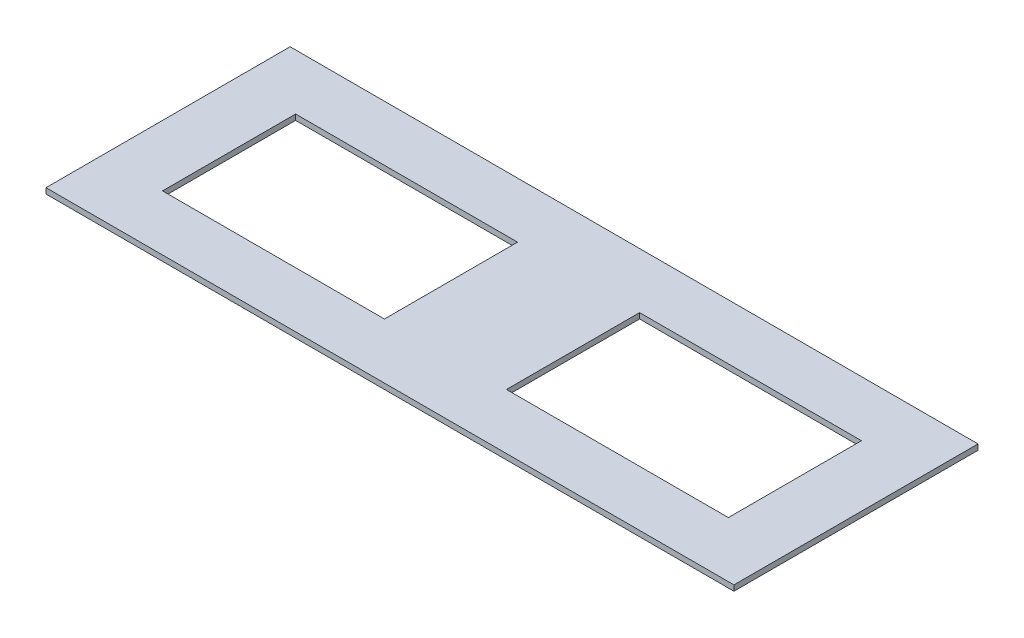
ISO-10303-21;
HEADER;
FILE_DESCRIPTION(('STEP AP214'),'2;1');
FILE_NAME('part.step','',(''),(''),'','','');
FILE_SCHEMA(('AUTOMOTIVE_DESIGN { 1 0 10303 214 1 1 1 1 }'));
ENDSEC;
DATA;
#1=APPLICATION_CONTEXT('core data for automotive mechanical design processes');
#2=APPLICATION_PROTOCOL_DEFINITION('international standard','automotive_design',2000,#1);
#3=PRODUCT_CONTEXT('',#1,'mechanical');
#4=PRODUCT('Part','Part','',(#3));
#5=PRODUCT_RELATED_PRODUCT_CATEGORY('part','',(#4));
#6=PRODUCT_DEFINITION_FORMATION('','',#4);
#7=PRODUCT_DEFINITION_CONTEXT('part definition',#1,'design');
#8=PRODUCT_DEFINITION('design','',#6,#7);
#9=PRODUCT_DEFINITION_SHAPE('','',#8);
#10=(LENGTH_UNIT() NAMED_UNIT(*) SI_UNIT(.MILLI.,.METRE.));
#11=(NAMED_UNIT(*) PLANE_ANGLE_UNIT() SI_UNIT($,.RADIAN.));
#12=(NAMED_UNIT(*) SI_UNIT($,.STERADIAN.) SOLID_ANGLE_UNIT());
#13=UNCERTAINTY_MEASURE_WITH_UNIT(LENGTH_MEASURE(1.E-05),#10,'distance_accuracy_value','');
#14=(GEOMETRIC_REPRESENTATION_CONTEXT(3) GLOBAL_UNCERTAINTY_ASSIGNED_CONTEXT((#13)) GLOBAL_UNIT_ASSIGNED_CONTEXT((#10,
#11,#12)) REPRESENTATION_CONTEXT('',''));
#15=CARTESIAN_POINT('',(0.,0.,0.));
#16=DIRECTION('',(0.,0.,1.));
#17=DIRECTION('',(1.,0.,0.));
#18=AXIS2_PLACEMENT_3D('',#15,#16,#17);
#19=CARTESIAN_POINT('',(0.,12.7,0.));
#20=DIRECTION('',(0.,-1.,0.));
#21=DIRECTION('',(0.,0.,-1.));
#22=AXIS2_PLACEMENT_3D('',#19,#20,#21);
#23=PLANE('',#22);
#24=DIRECTION('',(0.,0.,-1.));
#25=VECTOR('',#24,1.);
#26=CARTESIAN_POINT('',(-139.7,12.7,152.4));
#27=LINE('',#26,#25);
#28=CARTESIAN_POINT('',(-139.7,12.7,152.4));
#29=VERTEX_POINT('',#28);
#30=CARTESIAN_POINT('',(-139.7,12.7,-152.4));
#31=VERTEX_POINT('',#30);
#32=EDGE_CURVE('E158',#29,#31,#27,.T.);
#33=ORIENTED_EDGE('',*,*,#32,.F.);
#34=DIRECTION('',(1.,0.,0.));
#35=VECTOR('',#34,1.);
#36=CARTESIAN_POINT('',(-647.7,12.7,152.4));
#37=LINE('',#36,#35);
#38=CARTESIAN_POINT('',(-647.7,12.7,152.4));
#39=VERTEX_POINT('',#38);
#40=EDGE_CURVE('E166',#39,#29,#37,.T.);
#41=ORIENTED_EDGE('',*,*,#40,.F.);
#42=DIRECTION('',(0.,0.,1.));
#43=VECTOR('',#42,1.);
#44=CARTESIAN_POINT('',(-647.7,12.7,152.4));
#45=LINE('',#44,#43);
#46=CARTESIAN_POINT('',(-647.7,12.7,-152.4));
#47=VERTEX_POINT('',#46);
#48=EDGE_CURVE('E163',#47,#39,#45,.T.);
#49=ORIENTED_EDGE('',*,*,#48,.F.);
#50=DIRECTION('',(-1.,0.,0.));
#51=VECTOR('',#50,1.);
#52=CARTESIAN_POINT('',(-647.7,12.7,-152.4));
#53=LINE('',#52,#51);
#54=EDGE_CURVE('E160',#31,#47,#53,.T.);
#55=ORIENTED_EDGE('',*,*,#54,.F.);
#56=EDGE_LOOP('',(#33,#41,#49,#55));
#57=FACE_BOUND('',#56,.T.);
#58=DIRECTION('',(0.,0.,-1.));
#59=VECTOR('',#58,1.);
#60=CARTESIAN_POINT('',(787.4,12.7,279.4));
#61=LINE('',#60,#59);
#62=CARTESIAN_POINT('',(787.4,12.7,279.4));
#63=VERTEX_POINT('',#62);
#64=CARTESIAN_POINT('',(787.4,12.7,-279.4));
#65=VERTEX_POINT('',#64);
#66=EDGE_CURVE('E189',#63,#65,#61,.T.);
#67=ORIENTED_EDGE('',*,*,#66,.T.);
#68=DIRECTION('',(-1.,0.,0.));
#69=VECTOR('',#68,1.);
#70=CARTESIAN_POINT('',(-787.4,12.7,-279.4));
#71=LINE('',#70,#69);
#72=CARTESIAN_POINT('',(-787.4,12.7,-279.4));
#73=VERTEX_POINT('',#72);
#74=EDGE_CURVE('E192',#65,#73,#71,.T.);
#75=ORIENTED_EDGE('',*,*,#74,.T.);
#76=DIRECTION('',(0.,0.,1.));
#77=VECTOR('',#76,1.);
#78=CARTESIAN_POINT('',(-787.4,12.7,279.4));
#79=LINE('',#78,#77);
#80=CARTESIAN_POINT('',(-787.4,12.7,279.4));
#81=VERTEX_POINT('',#80);
#82=EDGE_CURVE('E195',#73,#81,#79,.T.);
#83=ORIENTED_EDGE('',*,*,#82,.T.);
#84=DIRECTION('',(1.,0.,0.));
#85=VECTOR('',#84,1.);
#86=CARTESIAN_POINT('',(-787.4,12.7,279.4));
#87=LINE('',#86,#85);
#88=EDGE_CURVE('E197',#81,#63,#87,.T.);
#89=ORIENTED_EDGE('',*,*,#88,.T.);
#90=EDGE_LOOP('',(#67,#75,#83,#89));
#91=FACE_BOUND('',#90,.T.);
#92=DIRECTION('',(0.,0.,-1.));
#93=VECTOR('',#92,1.);
#94=CARTESIAN_POINT('',(647.7,12.7,152.4));
#95=LINE('',#94,#93);
#96=CARTESIAN_POINT('',(647.7,12.7,152.4));
#97=VERTEX_POINT('',#96);
#98=CARTESIAN_POINT('',(647.7,12.7,-152.4));
#99=VERTEX_POINT('',#98);
#100=EDGE_CURVE('E122',#97,#99,#95,.T.);
#101=ORIENTED_EDGE('',*,*,#100,.F.);
#102=DIRECTION('',(1.,0.,0.));
#103=VECTOR('',#102,1.);
#104=CARTESIAN_POINT('',(139.7,12.7,152.4));
#105=LINE('',#104,#103);
#106=CARTESIAN_POINT('',(139.7,12.7,152.4));
#107=VERTEX_POINT('',#106);
#108=EDGE_CURVE('E144',#107,#97,#105,.T.);
#109=ORIENTED_EDGE('',*,*,#108,.F.);
#110=DIRECTION('',(0.,0.,1.));
#111=VECTOR('',#110,1.);
#112=CARTESIAN_POINT('',(139.7,12.7,152.4));
#113=LINE('',#112,#111);
#114=CARTESIAN_POINT('',(139.7,12.7,-152.4));
#115=VERTEX_POINT('',#114);
#116=EDGE_CURVE('E142',#115,#107,#113,.T.);
#117=ORIENTED_EDGE('',*,*,#116,.F.);
#118=DIRECTION('',(-1.,0.,0.));
#119=VECTOR('',#118,1.);
#120=CARTESIAN_POINT('',(139.7,12.7,-152.4));
#121=LINE('',#120,#119);
#122=EDGE_CURVE('E130',#99,#115,#121,.T.);
#123=ORIENTED_EDGE('',*,*,#122,.F.);
#124=EDGE_LOOP('',(#101,#109,#117,#123));
#125=FACE_BOUND('',#124,.T.);
#126=ADVANCED_FACE('F33',(#57,#91,#125),#23,.F.);
#127=CARTESIAN_POINT('',(0.,0.,0.));
#128=DIRECTION('',(0.,-1.,0.));
#129=DIRECTION('',(0.,0.,-1.));
#130=AXIS2_PLACEMENT_3D('',#127,#128,#129);
#131=PLANE('',#130);
#132=DIRECTION('',(0.,0.,-1.));
#133=VECTOR('',#132,1.);
#134=CARTESIAN_POINT('',(787.4,0.,279.4));
#135=LINE('',#134,#133);
#136=CARTESIAN_POINT('',(787.4,0.,279.4));
#137=VERTEX_POINT('',#136);
#138=CARTESIAN_POINT('',(787.4,0.,-279.4));
#139=VERTEX_POINT('',#138);
#140=EDGE_CURVE('E188',#137,#139,#135,.T.);
#141=ORIENTED_EDGE('',*,*,#140,.F.);
#142=DIRECTION('',(1.,0.,0.));
#143=VECTOR('',#142,1.);
#144=CARTESIAN_POINT('',(-787.4,0.,279.4));
#145=LINE('',#144,#143);
#146=CARTESIAN_POINT('',(-787.4,0.,279.4));
#147=VERTEX_POINT('',#146);
#148=EDGE_CURVE('E193',#147,#137,#145,.T.);
#149=ORIENTED_EDGE('',*,*,#148,.F.);
#150=DIRECTION('',(0.,0.,1.));
#151=VECTOR('',#150,1.);
#152=CARTESIAN_POINT('',(-787.4,0.,279.4));
#153=LINE('',#152,#151);
#154=CARTESIAN_POINT('',(-787.4,0.,-279.4));
#155=VERTEX_POINT('',#154);
#156=EDGE_CURVE('E204',#155,#147,#153,.T.);
#157=ORIENTED_EDGE('',*,*,#156,.F.);
#158=DIRECTION('',(-1.,0.,0.));
#159=VECTOR('',#158,1.);
#160=CARTESIAN_POINT('',(-787.4,0.,-279.4));
#161=LINE('',#160,#159);
#162=EDGE_CURVE('E202',#139,#155,#161,.T.);
#163=ORIENTED_EDGE('',*,*,#162,.F.);
#164=EDGE_LOOP('',(#141,#149,#157,#163));
#165=FACE_BOUND('',#164,.T.);
#166=DIRECTION('',(1.,0.,0.));
#167=VECTOR('',#166,1.);
#168=CARTESIAN_POINT('',(-647.7,0.,152.4));
#169=LINE('',#168,#167);
#170=CARTESIAN_POINT('',(-647.7,0.,152.4));
#171=VERTEX_POINT('',#170);
#172=CARTESIAN_POINT('',(-139.7,0.,152.4));
#173=VERTEX_POINT('',#172);
#174=EDGE_CURVE('E161',#171,#173,#169,.T.);
#175=ORIENTED_EDGE('',*,*,#174,.T.);
#176=DIRECTION('',(0.,0.,-1.));
#177=VECTOR('',#176,1.);
#178=CARTESIAN_POINT('',(-139.7,0.,152.4));
#179=LINE('',#178,#177);
#180=CARTESIAN_POINT('',(-139.7,0.,-152.4));
#181=VERTEX_POINT('',#180);
#182=EDGE_CURVE('E138',#173,#181,#179,.T.);
#183=ORIENTED_EDGE('',*,*,#182,.T.);
#184=DIRECTION('',(-1.,0.,0.));
#185=VECTOR('',#184,1.);
#186=CARTESIAN_POINT('',(-647.7,0.,-152.4));
#187=LINE('',#186,#185);
#188=CARTESIAN_POINT('',(-647.7,0.,-152.4));
#189=VERTEX_POINT('',#188);
#190=EDGE_CURVE('E171',#181,#189,#187,.T.);
#191=ORIENTED_EDGE('',*,*,#190,.T.);
#192=DIRECTION('',(0.,0.,1.));
#193=VECTOR('',#192,1.);
#194=CARTESIAN_POINT('',(-647.7,0.,152.4));
#195=LINE('',#194,#193);
#196=EDGE_CURVE('E174',#189,#171,#195,.T.);
#197=ORIENTED_EDGE('',*,*,#196,.T.);
#198=EDGE_LOOP('',(#175,#183,#191,#197));
#199=FACE_BOUND('',#198,.T.);
#200=DIRECTION('',(1.,0.,0.));
#201=VECTOR('',#200,1.);
#202=CARTESIAN_POINT('',(139.7,0.,152.4));
#203=LINE('',#202,#201);
#204=CARTESIAN_POINT('',(139.7,0.,152.4));
#205=VERTEX_POINT('',#204);
#206=CARTESIAN_POINT('',(647.7,0.,152.4));
#207=VERTEX_POINT('',#206);
#208=EDGE_CURVE('E131',#205,#207,#203,.T.);
#209=ORIENTED_EDGE('',*,*,#208,.T.);
#210=DIRECTION('',(0.,0.,-1.));
#211=VECTOR('',#210,1.);
#212=CARTESIAN_POINT('',(647.7,0.,152.4));
#213=LINE('',#212,#211);
#214=CARTESIAN_POINT('',(647.7,0.,-152.4));
#215=VERTEX_POINT('',#214);
#216=EDGE_CURVE('E56',#207,#215,#213,.T.);
#217=ORIENTED_EDGE('',*,*,#216,.T.);
#218=DIRECTION('',(-1.,0.,0.));
#219=VECTOR('',#218,1.);
#220=CARTESIAN_POINT('',(139.7,0.,-152.4));
#221=LINE('',#220,#219);
#222=CARTESIAN_POINT('',(139.7,0.,-152.4));
#223=VERTEX_POINT('',#222);
#224=EDGE_CURVE('E137',#215,#223,#221,.T.);
#225=ORIENTED_EDGE('',*,*,#224,.T.);
#226=DIRECTION('',(0.,0.,1.));
#227=VECTOR('',#226,1.);
#228=CARTESIAN_POINT('',(139.7,0.,152.4));
#229=LINE('',#228,#227);
#230=EDGE_CURVE('E150',#223,#205,#229,.T.);
#231=ORIENTED_EDGE('',*,*,#230,.T.);
#232=EDGE_LOOP('',(#209,#217,#225,#231));
#233=FACE_BOUND('',#232,.T.);
#234=ADVANCED_FACE('F222',(#165,#199,#233),#131,.T.);
#235=CARTESIAN_POINT('',(787.4,12.7,279.4));
#236=DIRECTION('',(-1.,0.,0.));
#237=DIRECTION('',(0.,0.,1.));
#238=AXIS2_PLACEMENT_3D('',#235,#236,#237);
#239=PLANE('',#238);
#240=ORIENTED_EDGE('',*,*,#140,.T.);
#241=DIRECTION('',(0.,-1.,0.));
#242=VECTOR('',#241,1.);
#243=CARTESIAN_POINT('',(787.4,12.7,-279.4));
#244=LINE('',#243,#242);
#245=EDGE_CURVE('E11',#65,#139,#244,.T.);
#246=ORIENTED_EDGE('',*,*,#245,.F.);
#247=ORIENTED_EDGE('',*,*,#66,.F.);
#248=DIRECTION('',(0.,-1.,0.));
#249=VECTOR('',#248,1.);
#250=CARTESIAN_POINT('',(787.4,12.7,279.4));
#251=LINE('',#250,#249);
#252=EDGE_CURVE('E199',#63,#137,#251,.T.);
#253=ORIENTED_EDGE('',*,*,#252,.T.);
#254=EDGE_LOOP('',(#240,#246,#247,#253));
#255=FACE_BOUND('',#254,.T.);
#256=ADVANCED_FACE('F35',(#255),#239,.F.);
#257=CARTESIAN_POINT('',(-787.4,12.7,-279.4));
#258=DIRECTION('',(0.,0.,1.));
#259=DIRECTION('',(1.,0.,0.));
#260=AXIS2_PLACEMENT_3D('',#257,#258,#259);
#261=PLANE('',#260);
#262=ORIENTED_EDGE('',*,*,#162,.T.);
#263=DIRECTION('',(0.,-1.,0.));
#264=VECTOR('',#263,1.);
#265=CARTESIAN_POINT('',(-787.4,12.7,-279.4));
#266=LINE('',#265,#264);
#267=EDGE_CURVE('E41',#73,#155,#266,.T.);
#268=ORIENTED_EDGE('',*,*,#267,.F.);
#269=ORIENTED_EDGE('',*,*,#74,.F.);
#270=ORIENTED_EDGE('',*,*,#245,.T.);
#271=EDGE_LOOP('',(#262,#268,#269,#270));
#272=FACE_BOUND('',#271,.T.);
#273=ADVANCED_FACE('F232',(#272),#261,.F.);
#274=CARTESIAN_POINT('',(-787.4,12.7,279.4));
#275=DIRECTION('',(1.,0.,0.));
#276=DIRECTION('',(0.,0.,-1.));
#277=AXIS2_PLACEMENT_3D('',#274,#275,#276);
#278=PLANE('',#277);
#279=ORIENTED_EDGE('',*,*,#156,.T.);
#280=DIRECTION('',(0.,-1.,0.));
#281=VECTOR('',#280,1.);
#282=CARTESIAN_POINT('',(-787.4,12.7,279.4));
#283=LINE('',#282,#281);
#284=EDGE_CURVE('E209',#81,#147,#283,.T.);
#285=ORIENTED_EDGE('',*,*,#284,.F.);
#286=ORIENTED_EDGE('',*,*,#82,.F.);
#287=ORIENTED_EDGE('',*,*,#267,.T.);
#288=EDGE_LOOP('',(#279,#285,#286,#287));
#289=FACE_BOUND('',#288,.T.);
#290=ADVANCED_FACE('F216',(#289),#278,.F.);
#291=CARTESIAN_POINT('',(-787.4,12.7,279.4));
#292=DIRECTION('',(0.,0.,-1.));
#293=DIRECTION('',(-1.,0.,0.));
#294=AXIS2_PLACEMENT_3D('',#291,#292,#293);
#295=PLANE('',#294);
#296=ORIENTED_EDGE('',*,*,#148,.T.);
#297=ORIENTED_EDGE('',*,*,#252,.F.);
#298=ORIENTED_EDGE('',*,*,#88,.F.);
#299=ORIENTED_EDGE('',*,*,#284,.T.);
#300=EDGE_LOOP('',(#296,#297,#298,#299));
#301=FACE_BOUND('',#300,.T.);
#302=ADVANCED_FACE('F226',(#301),#295,.F.);
#303=CARTESIAN_POINT('',(-139.7,12.7,152.4));
#304=DIRECTION('',(-1.,0.,0.));
#305=DIRECTION('',(0.,0.,1.));
#306=AXIS2_PLACEMENT_3D('',#303,#304,#305);
#307=PLANE('',#306);
#308=ORIENTED_EDGE('',*,*,#182,.F.);
#309=DIRECTION('',(0.,-1.,0.));
#310=VECTOR('',#309,1.);
#311=CARTESIAN_POINT('',(-139.7,12.7,152.4));
#312=LINE('',#311,#310);
#313=EDGE_CURVE('E168',#29,#173,#312,.T.);
#314=ORIENTED_EDGE('',*,*,#313,.F.);
#315=ORIENTED_EDGE('',*,*,#32,.T.);
#316=DIRECTION('',(0.,-1.,0.));
#317=VECTOR('',#316,1.);
#318=CARTESIAN_POINT('',(-139.7,12.7,-152.4));
#319=LINE('',#318,#317);
#320=EDGE_CURVE('E185',#31,#181,#319,.T.);
#321=ORIENTED_EDGE('',*,*,#320,.T.);
#322=EDGE_LOOP('',(#308,#314,#315,#321));
#323=FACE_BOUND('',#322,.T.);
#324=ADVANCED_FACE('F248',(#323),#307,.T.);
#325=CARTESIAN_POINT('',(-647.7,12.7,-152.4));
#326=DIRECTION('',(0.,0.,1.));
#327=DIRECTION('',(1.,0.,0.));
#328=AXIS2_PLACEMENT_3D('',#325,#326,#327);
#329=PLANE('',#328);
#330=ORIENTED_EDGE('',*,*,#190,.F.);
#331=ORIENTED_EDGE('',*,*,#320,.F.);
#332=ORIENTED_EDGE('',*,*,#54,.T.);
#333=DIRECTION('',(0.,-1.,0.));
#334=VECTOR('',#333,1.);
#335=CARTESIAN_POINT('',(-647.7,12.7,-152.4));
#336=LINE('',#335,#334);
#337=EDGE_CURVE('E183',#47,#189,#336,.T.);
#338=ORIENTED_EDGE('',*,*,#337,.T.);
#339=EDGE_LOOP('',(#330,#331,#332,#338));
#340=FACE_BOUND('',#339,.T.);
#341=ADVANCED_FACE('F255',(#340),#329,.T.);
#342=CARTESIAN_POINT('',(-647.7,12.7,152.4));
#343=DIRECTION('',(1.,0.,0.));
#344=DIRECTION('',(0.,0.,-1.));
#345=AXIS2_PLACEMENT_3D('',#342,#343,#344);
#346=PLANE('',#345);
#347=ORIENTED_EDGE('',*,*,#196,.F.);
#348=ORIENTED_EDGE('',*,*,#337,.F.);
#349=ORIENTED_EDGE('',*,*,#48,.T.);
#350=DIRECTION('',(0.,-1.,0.));
#351=VECTOR('',#350,1.);
#352=CARTESIAN_POINT('',(-647.7,12.7,152.4));
#353=LINE('',#352,#351);
#354=EDGE_CURVE('E181',#39,#171,#353,.T.);
#355=ORIENTED_EDGE('',*,*,#354,.T.);
#356=EDGE_LOOP('',(#347,#348,#349,#355));
#357=FACE_BOUND('',#356,.T.);
#358=ADVANCED_FACE('F260',(#357),#346,.T.);
#359=CARTESIAN_POINT('',(-647.7,12.7,152.4));
#360=DIRECTION('',(0.,0.,-1.));
#361=DIRECTION('',(-1.,0.,0.));
#362=AXIS2_PLACEMENT_3D('',#359,#360,#361);
#363=PLANE('',#362);
#364=ORIENTED_EDGE('',*,*,#174,.F.);
#365=ORIENTED_EDGE('',*,*,#354,.F.);
#366=ORIENTED_EDGE('',*,*,#40,.T.);
#367=ORIENTED_EDGE('',*,*,#313,.T.);
#368=EDGE_LOOP('',(#364,#365,#366,#367));
#369=FACE_BOUND('',#368,.T.);
#370=ADVANCED_FACE('F266',(#369),#363,.T.);
#371=CARTESIAN_POINT('',(647.7,12.7,152.4));
#372=DIRECTION('',(-1.,0.,0.));
#373=DIRECTION('',(0.,0.,1.));
#374=AXIS2_PLACEMENT_3D('',#371,#372,#373);
#375=PLANE('',#374);
#376=ORIENTED_EDGE('',*,*,#216,.F.);
#377=DIRECTION('',(0.,-1.,0.));
#378=VECTOR('',#377,1.);
#379=CARTESIAN_POINT('',(647.7,12.7,152.4));
#380=LINE('',#379,#378);
#381=EDGE_CURVE('E126',#97,#207,#380,.T.);
#382=ORIENTED_EDGE('',*,*,#381,.F.);
#383=ORIENTED_EDGE('',*,*,#100,.T.);
#384=DIRECTION('',(0.,-1.,0.));
#385=VECTOR('',#384,1.);
#386=CARTESIAN_POINT('',(647.7,12.7,-152.4));
#387=LINE('',#386,#385);
#388=EDGE_CURVE('E125',#99,#215,#387,.T.);
#389=ORIENTED_EDGE('',*,*,#388,.T.);
#390=EDGE_LOOP('',(#376,#382,#383,#389));
#391=FACE_BOUND('',#390,.T.);
#392=ADVANCED_FACE('F124',(#391),#375,.T.);
#393=CARTESIAN_POINT('',(139.7,12.7,-152.4));
#394=DIRECTION('',(0.,0.,1.));
#395=DIRECTION('',(1.,0.,0.));
#396=AXIS2_PLACEMENT_3D('',#393,#394,#395);
#397=PLANE('',#396);
#398=ORIENTED_EDGE('',*,*,#224,.F.);
#399=ORIENTED_EDGE('',*,*,#388,.F.);
#400=ORIENTED_EDGE('',*,*,#122,.T.);
#401=DIRECTION('',(0.,-1.,0.));
#402=VECTOR('',#401,1.);
#403=CARTESIAN_POINT('',(139.7,12.7,-152.4));
#404=LINE('',#403,#402);
#405=EDGE_CURVE('E139',#115,#223,#404,.T.);
#406=ORIENTED_EDGE('',*,*,#405,.T.);
#407=EDGE_LOOP('',(#398,#399,#400,#406));
#408=FACE_BOUND('',#407,.T.);
#409=ADVANCED_FACE('F134',(#408),#397,.T.);
#410=CARTESIAN_POINT('',(139.7,12.7,152.4));
#411=DIRECTION('',(1.,0.,0.));
#412=DIRECTION('',(0.,0.,-1.));
#413=AXIS2_PLACEMENT_3D('',#410,#411,#412);
#414=PLANE('',#413);
#415=ORIENTED_EDGE('',*,*,#230,.F.);
#416=ORIENTED_EDGE('',*,*,#405,.F.);
#417=ORIENTED_EDGE('',*,*,#116,.T.);
#418=DIRECTION('',(0.,-1.,0.));
#419=VECTOR('',#418,1.);
#420=CARTESIAN_POINT('',(139.7,12.7,152.4));
#421=LINE('',#420,#419);
#422=EDGE_CURVE('E48',#107,#205,#421,.T.);
#423=ORIENTED_EDGE('',*,*,#422,.T.);
#424=EDGE_LOOP('',(#415,#416,#417,#423));
#425=FACE_BOUND('',#424,.T.);
#426=ADVANCED_FACE('F285',(#425),#414,.T.);
#427=CARTESIAN_POINT('',(139.7,12.7,152.4));
#428=DIRECTION('',(0.,0.,-1.));
#429=DIRECTION('',(-1.,0.,0.));
#430=AXIS2_PLACEMENT_3D('',#427,#428,#429);
#431=PLANE('',#430);
#432=ORIENTED_EDGE('',*,*,#208,.F.);
#433=ORIENTED_EDGE('',*,*,#422,.F.);
#434=ORIENTED_EDGE('',*,*,#108,.T.);
#435=ORIENTED_EDGE('',*,*,#381,.T.);
#436=EDGE_LOOP('',(#432,#433,#434,#435));
#437=FACE_BOUND('',#436,.T.);
#438=ADVANCED_FACE('F288',(#437),#431,.T.);
#439=CLOSED_SHELL('',(#126,#234,#256,#273,#290,#302,#324,#341,#358,#370,#392,#409,#426,#438));
#440=MANIFOLD_SOLID_BREP('B2',#439);
#441=ADVANCED_BREP_SHAPE_REPRESENTATION('',(#18,#440),#14);
#442=SHAPE_DEFINITION_REPRESENTATION(#9,#441);
ENDSEC;
END-ISO-10303-21;
